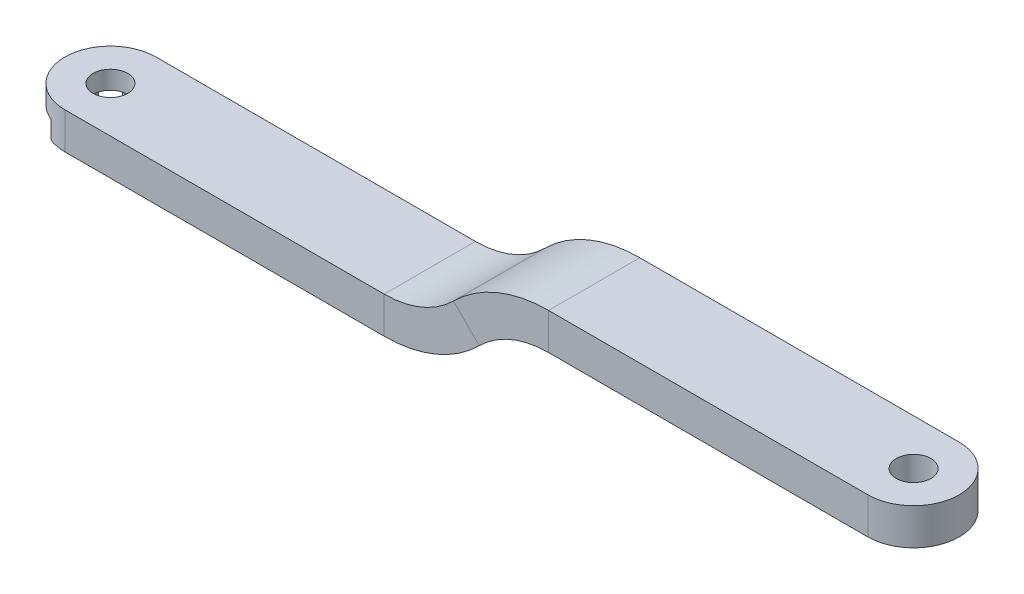
ISO-10303-21;
HEADER;
FILE_DESCRIPTION(('STEP AP214'),'2;1');
FILE_NAME('part.step','',(''),(''),'','','');
FILE_SCHEMA(('AUTOMOTIVE_DESIGN { 1 0 10303 214 1 1 1 1 }'));
ENDSEC;
DATA;
#1=APPLICATION_CONTEXT('core data for automotive mechanical design processes');
#2=APPLICATION_PROTOCOL_DEFINITION('international standard','automotive_design',2000,#1);
#3=PRODUCT_CONTEXT('',#1,'mechanical');
#4=PRODUCT('Part','Part','',(#3));
#5=PRODUCT_RELATED_PRODUCT_CATEGORY('part','',(#4));
#6=PRODUCT_DEFINITION_FORMATION('','',#4);
#7=PRODUCT_DEFINITION_CONTEXT('part definition',#1,'design');
#8=PRODUCT_DEFINITION('design','',#6,#7);
#9=PRODUCT_DEFINITION_SHAPE('','',#8);
#10=(LENGTH_UNIT() NAMED_UNIT(*) SI_UNIT(.MILLI.,.METRE.));
#11=(NAMED_UNIT(*) PLANE_ANGLE_UNIT() SI_UNIT($,.RADIAN.));
#12=(NAMED_UNIT(*) SI_UNIT($,.STERADIAN.) SOLID_ANGLE_UNIT());
#13=UNCERTAINTY_MEASURE_WITH_UNIT(LENGTH_MEASURE(1.E-05),#10,'distance_accuracy_value','');
#14=(GEOMETRIC_REPRESENTATION_CONTEXT(3) GLOBAL_UNCERTAINTY_ASSIGNED_CONTEXT((#13)) GLOBAL_UNIT_ASSIGNED_CONTEXT((#10,
#11,#12)) REPRESENTATION_CONTEXT('',''));
#15=CARTESIAN_POINT('',(0.,0.,0.));
#16=DIRECTION('',(0.,0.,1.));
#17=DIRECTION('',(1.,0.,0.));
#18=AXIS2_PLACEMENT_3D('',#15,#16,#17);
#19=CARTESIAN_POINT('',(0.,-2.53999999999999,6.35));
#20=DIRECTION('',(0.,-1.,0.));
#21=DIRECTION('',(0.,0.,-1.));
#22=AXIS2_PLACEMENT_3D('',#19,#20,#21);
#23=PLANE('',#22);
#24=DIRECTION('',(-0.923879532511286,0.,-0.382683432365092));
#25=VECTOR('',#24,1.);
#26=CARTESIAN_POINT('',(3.5340151849056,-2.53999999999999,-1.1664191018488));
#27=LINE('',#26,#25);
#28=CARTESIAN_POINT('',(3.5340151849056,-2.53999999999999,-1.16641910184879));
#29=VERTEX_POINT('',#28);
#30=CARTESIAN_POINT('',(0.483364968553333,-2.53999999999999,-2.43003979551833));
#31=VERTEX_POINT('',#30);
#32=EDGE_CURVE('E312',#29,#31,#27,.T.);
#33=ORIENTED_EDGE('',*,*,#32,.F.);
#34=CARTESIAN_POINT('',(6.35,-2.53999999999999,0.));
#35=DIRECTION('',(0.,-1.,0.));
#36=DIRECTION('',(0.,0.,-1.));
#37=AXIS2_PLACEMENT_3D('',#34,#35,#36);
#38=CIRCLE('',#37,3.048);
#39=CARTESIAN_POINT('',(3.5340151849056,-2.53999999999999,1.1664191018488));
#40=VERTEX_POINT('',#39);
#41=EDGE_CURVE('E309',#40,#29,#38,.T.);
#42=ORIENTED_EDGE('',*,*,#41,.F.);
#43=DIRECTION('',(0.923879532511287,0.,-0.38268343236509));
#44=VECTOR('',#43,1.);
#45=CARTESIAN_POINT('',(3.5340151849056,-2.53999999999999,1.1664191018488));
#46=LINE('',#45,#44);
#47=CARTESIAN_POINT('',(0.483364968553331,-2.53999999999999,2.43003979551832));
#48=VERTEX_POINT('',#47);
#49=EDGE_CURVE('E306',#48,#40,#46,.T.);
#50=ORIENTED_EDGE('',*,*,#49,.F.);
#51=CARTESIAN_POINT('',(6.35,-2.53999999999999,0.));
#52=DIRECTION('',(0.,-1.,0.));
#53=DIRECTION('',(0.,0.,-1.));
#54=AXIS2_PLACEMENT_3D('',#51,#52,#53);
#55=CIRCLE('',#54,6.35);
#56=EDGE_CURVE('E458',#48,#31,#55,.T.);
#57=ORIENTED_EDGE('',*,*,#56,.T.);
#58=EDGE_LOOP('',(#33,#42,#50,#57));
#59=FACE_BOUND('',#58,.T.);
#60=ADVANCED_FACE('F53',(#59),#23,.T.);
#61=CARTESIAN_POINT('',(6.35,-2.53999999999999,0.));
#62=DIRECTION('',(0.,1.,0.));
#63=DIRECTION('',(0.,0.,1.));
#64=AXIS2_PLACEMENT_3D('',#61,#62,#63);
#65=CYLINDRICAL_SURFACE('',#64,2.413);
#66=CARTESIAN_POINT('',(6.35,2.53999999999999,0.));
#67=DIRECTION('',(0.,1.,0.));
#68=DIRECTION('',(0.,0.,1.));
#69=AXIS2_PLACEMENT_3D('',#66,#67,#68);
#70=CIRCLE('',#69,2.413);
#71=CARTESIAN_POINT('',(6.35,2.53999999999999,2.413));
#72=VERTEX_POINT('',#71);
#73=EDGE_CURVE('E360',#72,#72,#70,.T.);
#74=ORIENTED_EDGE('',*,*,#73,.T.);
#75=EDGE_LOOP('',(#74));
#76=FACE_BOUND('',#75,.T.);
#77=CARTESIAN_POINT('',(6.35,0.,0.));
#78=DIRECTION('',(0.,-1.,0.));
#79=DIRECTION('',(0.,0.,1.));
#80=AXIS2_PLACEMENT_3D('',#77,#78,#79);
#81=CIRCLE('',#80,2.413);
#82=CARTESIAN_POINT('',(6.35,0.,2.413));
#83=VERTEX_POINT('',#82);
#84=EDGE_CURVE('E253',#83,#83,#81,.T.);
#85=ORIENTED_EDGE('',*,*,#84,.T.);
#86=EDGE_LOOP('',(#85));
#87=FACE_BOUND('',#86,.T.);
#88=ADVANCED_FACE('F579',(#76,#87),#65,.F.);
#89=CARTESIAN_POINT('',(118.118034430391,6.93225000588271,0.));
#90=DIRECTION('',(0.,-1.,0.));
#91=DIRECTION('',(0.,0.,-1.));
#92=AXIS2_PLACEMENT_3D('',#89,#90,#91);
#93=CYLINDRICAL_SURFACE('',#92,6.35);
#94=DIRECTION('',(0.,1.,0.));
#95=VECTOR('',#94,1.);
#96=CARTESIAN_POINT('',(118.118034430391,6.93225000588271,6.35));
#97=LINE('',#96,#95);
#98=CARTESIAN_POINT('',(118.118034430391,6.93225000588271,6.35));
#99=VERTEX_POINT('',#98);
#100=CARTESIAN_POINT('',(118.118034430391,12.0122500058827,6.35));
#101=VERTEX_POINT('',#100);
#102=EDGE_CURVE('E457',#99,#101,#97,.T.);
#103=ORIENTED_EDGE('',*,*,#102,.F.);
#104=CARTESIAN_POINT('',(118.118034430391,6.93225000588271,0.));
#105=DIRECTION('',(0.,-1.,0.));
#106=DIRECTION('',(1.,0.,0.));
#107=AXIS2_PLACEMENT_3D('',#104,#105,#106);
#108=CIRCLE('',#107,6.35);
#109=CARTESIAN_POINT('',(118.118034430391,6.93225000588271,-6.35));
#110=VERTEX_POINT('',#109);
#111=EDGE_CURVE('E62',#110,#99,#108,.T.);
#112=ORIENTED_EDGE('',*,*,#111,.F.);
#113=DIRECTION('',(0.,1.,0.));
#114=VECTOR('',#113,1.);
#115=CARTESIAN_POINT('',(118.118034430391,6.93225000588271,-6.35));
#116=LINE('',#115,#114);
#117=CARTESIAN_POINT('',(118.118034430391,12.0122500058827,-6.35));
#118=VERTEX_POINT('',#117);
#119=EDGE_CURVE('E461',#118,#110,#116,.F.);
#120=ORIENTED_EDGE('',*,*,#119,.F.);
#121=CARTESIAN_POINT('',(118.118034430391,12.0122500058827,0.));
#122=DIRECTION('',(0.,1.,0.));
#123=DIRECTION('',(-1.,0.,0.));
#124=AXIS2_PLACEMENT_3D('',#121,#122,#123);
#125=CIRCLE('',#124,6.35);
#126=EDGE_CURVE('E13',#101,#118,#125,.T.);
#127=ORIENTED_EDGE('',*,*,#126,.F.);
#128=EDGE_LOOP('',(#103,#112,#120,#127));
#129=FACE_BOUND('',#128,.T.);
#130=ADVANCED_FACE('F56',(#129),#93,.T.);
#131=CARTESIAN_POINT('',(6.35,2.53999999999999,0.));
#132=DIRECTION('',(0.,-1.,0.));
#133=DIRECTION('',(0.,0.,-1.));
#134=AXIS2_PLACEMENT_3D('',#131,#132,#133);
#135=CYLINDRICAL_SURFACE('',#134,6.35);
#136=DIRECTION('',(0.,-1.,0.));
#137=VECTOR('',#136,1.);
#138=CARTESIAN_POINT('',(3.91996020448168,0.,-5.86663503144667));
#139=LINE('',#138,#137);
#140=CARTESIAN_POINT('',(3.91996020448168,0.,-5.86663503144667));
#141=VERTEX_POINT('',#140);
#142=CARTESIAN_POINT('',(3.91996020448168,-2.53999999999999,-5.86663503144667));
#143=VERTEX_POINT('',#142);
#144=EDGE_CURVE('E336',#141,#143,#139,.T.);
#145=ORIENTED_EDGE('',*,*,#144,.F.);
#146=CARTESIAN_POINT('',(6.35,0.,0.));
#147=DIRECTION('',(0.,-1.,0.));
#148=DIRECTION('',(0.,0.,-1.));
#149=AXIS2_PLACEMENT_3D('',#146,#147,#148);
#150=CIRCLE('',#149,6.35);
#151=CARTESIAN_POINT('',(0.483364968553335,0.,-2.43003979551833));
#152=VERTEX_POINT('',#151);
#153=EDGE_CURVE('E277',#152,#141,#150,.T.);
#154=ORIENTED_EDGE('',*,*,#153,.F.);
#155=DIRECTION('',(0.,-1.,0.));
#156=VECTOR('',#155,1.);
#157=CARTESIAN_POINT('',(0.483364968553335,0.,-2.43003979551833));
#158=LINE('',#157,#156);
#159=EDGE_CURVE('E338',#152,#31,#158,.T.);
#160=ORIENTED_EDGE('',*,*,#159,.T.);
#161=ORIENTED_EDGE('',*,*,#56,.F.);
#162=DIRECTION('',(0.,-1.,0.));
#163=VECTOR('',#162,1.);
#164=CARTESIAN_POINT('',(0.483364968553333,0.,2.43003979551832));
#165=LINE('',#164,#163);
#166=CARTESIAN_POINT('',(0.483364968553333,0.,2.43003979551832));
#167=VERTEX_POINT('',#166);
#168=EDGE_CURVE('E345',#167,#48,#165,.T.);
#169=ORIENTED_EDGE('',*,*,#168,.F.);
#170=CARTESIAN_POINT('',(6.35,0.,0.));
#171=DIRECTION('',(0.,-1.,0.));
#172=DIRECTION('',(0.,0.,-1.));
#173=AXIS2_PLACEMENT_3D('',#170,#171,#172);
#174=CIRCLE('',#173,6.35);
#175=CARTESIAN_POINT('',(3.91996020448168,0.,5.86663503144667));
#176=VERTEX_POINT('',#175);
#177=EDGE_CURVE('E265',#176,#167,#174,.T.);
#178=ORIENTED_EDGE('',*,*,#177,.F.);
#179=DIRECTION('',(0.,-1.,0.));
#180=VECTOR('',#179,1.);
#181=CARTESIAN_POINT('',(3.91996020448168,0.,5.86663503144667));
#182=LINE('',#181,#180);
#183=CARTESIAN_POINT('',(3.91996020448168,-2.53999999999999,5.86663503144667));
#184=VERTEX_POINT('',#183);
#185=EDGE_CURVE('E347',#176,#184,#182,.T.);
#186=ORIENTED_EDGE('',*,*,#185,.T.);
#187=CARTESIAN_POINT('',(6.35,-2.53999999999999,6.35));
#188=VERTEX_POINT('',#187);
#189=EDGE_CURVE('E454',#188,#184,#55,.T.);
#190=ORIENTED_EDGE('',*,*,#189,.F.);
#191=DIRECTION('',(0.,-1.,0.));
#192=VECTOR('',#191,1.);
#193=CARTESIAN_POINT('',(6.35,-2.53999999999999,6.35));
#194=LINE('',#193,#192);
#195=CARTESIAN_POINT('',(6.35,2.53999999999999,6.35));
#196=VERTEX_POINT('',#195);
#197=EDGE_CURVE('E437',#196,#188,#194,.T.);
#198=ORIENTED_EDGE('',*,*,#197,.F.);
#199=CARTESIAN_POINT('',(6.35,2.53999999999999,0.));
#200=DIRECTION('',(0.,1.,0.));
#201=DIRECTION('',(0.,0.,1.));
#202=AXIS2_PLACEMENT_3D('',#199,#200,#201);
#203=CIRCLE('',#202,6.35);
#204=CARTESIAN_POINT('',(6.35,2.53999999999999,-6.35));
#205=VERTEX_POINT('',#204);
#206=EDGE_CURVE('E451',#205,#196,#203,.T.);
#207=ORIENTED_EDGE('',*,*,#206,.F.);
#208=DIRECTION('',(0.,-1.,0.));
#209=VECTOR('',#208,1.);
#210=CARTESIAN_POINT('',(6.35,-2.53999999999999,-6.35));
#211=LINE('',#210,#209);
#212=CARTESIAN_POINT('',(6.35,-2.53999999999999,-6.35));
#213=VERTEX_POINT('',#212);
#214=EDGE_CURVE('E448',#213,#205,#211,.F.);
#215=ORIENTED_EDGE('',*,*,#214,.F.);
#216=EDGE_CURVE('E453',#143,#213,#55,.T.);
#217=ORIENTED_EDGE('',*,*,#216,.F.);
#218=EDGE_LOOP('',(#145,#154,#160,#161,#169,#178,#186,#190,#198,#207,#215,#217));
#219=FACE_BOUND('',#218,.T.);
#220=ADVANCED_FACE('F521',(#219),#135,.T.);
#221=CARTESIAN_POINT('',(0.,-2.53999999999999,-6.35));
#222=DIRECTION('',(0.,0.,-1.));
#223=DIRECTION('',(-1.,0.,0.));
#224=AXIS2_PLACEMENT_3D('',#221,#222,#223);
#225=PLANE('',#224);
#226=DIRECTION('',(1.,0.,0.));
#227=VECTOR('',#226,1.);
#228=CARTESIAN_POINT('',(0.,-2.53999999999999,-6.35));
#229=LINE('',#228,#227);
#230=CARTESIAN_POINT('',(50.8,-2.53999999999999,-6.35));
#231=VERTEX_POINT('',#230);
#232=EDGE_CURVE('E363',#213,#231,#229,.T.);
#233=ORIENTED_EDGE('',*,*,#232,.F.);
#234=ORIENTED_EDGE('',*,*,#214,.T.);
#235=DIRECTION('',(1.,0.,0.));
#236=VECTOR('',#235,1.);
#237=CARTESIAN_POINT('',(0.,2.53999999999999,-6.35));
#238=LINE('',#237,#236);
#239=CARTESIAN_POINT('',(50.8,2.53999999999999,-6.35));
#240=VERTEX_POINT('',#239);
#241=EDGE_CURVE('E367',#205,#240,#238,.T.);
#242=ORIENTED_EDGE('',*,*,#241,.T.);
#243=DIRECTION('',(0.,1.,0.));
#244=VECTOR('',#243,1.);
#245=CARTESIAN_POINT('',(50.8,-2.53999999999999,-6.35));
#246=LINE('',#245,#244);
#247=EDGE_CURVE('E364',#231,#240,#246,.T.);
#248=ORIENTED_EDGE('',*,*,#247,.F.);
#249=EDGE_LOOP('',(#233,#234,#242,#248));
#250=FACE_BOUND('',#249,.T.);
#251=ADVANCED_FACE('F499',(#250),#225,.T.);
#252=CARTESIAN_POINT('',(0.,2.53999999999999,6.35));
#253=DIRECTION('',(0.,1.,0.));
#254=DIRECTION('',(0.,0.,1.));
#255=AXIS2_PLACEMENT_3D('',#252,#253,#254);
#256=PLANE('',#255);
#257=ORIENTED_EDGE('',*,*,#73,.F.);
#258=EDGE_LOOP('',(#257));
#259=FACE_BOUND('',#258,.T.);
#260=ORIENTED_EDGE('',*,*,#241,.F.);
#261=ORIENTED_EDGE('',*,*,#206,.T.);
#262=DIRECTION('',(1.,0.,0.));
#263=VECTOR('',#262,1.);
#264=CARTESIAN_POINT('',(0.,2.53999999999999,6.35));
#265=LINE('',#264,#263);
#266=CARTESIAN_POINT('',(50.8,2.53999999999999,6.35));
#267=VERTEX_POINT('',#266);
#268=EDGE_CURVE('E403',#196,#267,#265,.T.);
#269=ORIENTED_EDGE('',*,*,#268,.T.);
#270=DIRECTION('',(0.,0.,1.));
#271=VECTOR('',#270,1.);
#272=CARTESIAN_POINT('',(50.8,2.53999999999999,6.35));
#273=LINE('',#272,#271);
#274=EDGE_CURVE('E369',#240,#267,#273,.T.);
#275=ORIENTED_EDGE('',*,*,#274,.F.);
#276=EDGE_LOOP('',(#260,#261,#269,#275));
#277=FACE_BOUND('',#276,.T.);
#278=ADVANCED_FACE('F506',(#259,#277),#256,.T.);
#279=CARTESIAN_POINT('',(0.,-2.53999999999999,6.35));
#280=DIRECTION('',(0.,0.,1.));
#281=DIRECTION('',(1.,0.,0.));
#282=AXIS2_PLACEMENT_3D('',#279,#280,#281);
#283=PLANE('',#282);
#284=ORIENTED_EDGE('',*,*,#268,.F.);
#285=ORIENTED_EDGE('',*,*,#197,.T.);
#286=DIRECTION('',(1.,0.,0.));
#287=VECTOR('',#286,1.);
#288=CARTESIAN_POINT('',(0.,-2.53999999999999,6.35));
#289=LINE('',#288,#287);
#290=CARTESIAN_POINT('',(50.8,-2.53999999999999,6.35));
#291=VERTEX_POINT('',#290);
#292=EDGE_CURVE('E423',#188,#291,#289,.T.);
#293=ORIENTED_EDGE('',*,*,#292,.T.);
#294=DIRECTION('',(0.,-1.,0.));
#295=VECTOR('',#294,1.);
#296=CARTESIAN_POINT('',(50.8,-2.53999999999999,6.35));
#297=LINE('',#296,#295);
#298=EDGE_CURVE('E405',#267,#291,#297,.T.);
#299=ORIENTED_EDGE('',*,*,#298,.F.);
#300=EDGE_LOOP('',(#284,#285,#293,#299));
#301=FACE_BOUND('',#300,.T.);
#302=ADVANCED_FACE('F514',(#301),#283,.T.);
#303=DIRECTION('',(0.38268343236509,0.,0.923879532511287));
#304=VECTOR('',#303,1.);
#305=CARTESIAN_POINT('',(5.18358089815121,-2.53999999999999,-2.8159848150944));
#306=LINE('',#305,#304);
#307=CARTESIAN_POINT('',(5.18358089815121,-2.53999999999999,-2.8159848150944));
#308=VERTEX_POINT('',#307);
#309=EDGE_CURVE('E314',#143,#308,#306,.T.);
#310=ORIENTED_EDGE('',*,*,#309,.F.);
#311=ORIENTED_EDGE('',*,*,#216,.T.);
#312=ORIENTED_EDGE('',*,*,#232,.T.);
#313=DIRECTION('',(0.,0.,-1.));
#314=VECTOR('',#313,1.);
#315=CARTESIAN_POINT('',(50.8,-2.53999999999999,6.35));
#316=LINE('',#315,#314);
#317=EDGE_CURVE('E381',#291,#231,#316,.T.);
#318=ORIENTED_EDGE('',*,*,#317,.F.);
#319=ORIENTED_EDGE('',*,*,#292,.F.);
#320=ORIENTED_EDGE('',*,*,#189,.T.);
#321=DIRECTION('',(-0.382683432365092,0.,0.923879532511286));
#322=VECTOR('',#321,1.);
#323=CARTESIAN_POINT('',(5.18358089815121,-2.53999999999999,2.8159848150944));
#324=LINE('',#323,#322);
#325=CARTESIAN_POINT('',(5.18358089815121,-2.53999999999999,2.8159848150944));
#326=VERTEX_POINT('',#325);
#327=EDGE_CURVE('E304',#326,#184,#324,.T.);
#328=ORIENTED_EDGE('',*,*,#327,.F.);
#329=CARTESIAN_POINT('',(6.35,-2.53999999999999,0.));
#330=DIRECTION('',(0.,-1.,0.));
#331=DIRECTION('',(0.,0.,-1.));
#332=AXIS2_PLACEMENT_3D('',#329,#330,#331);
#333=CIRCLE('',#332,3.048);
#334=CARTESIAN_POINT('',(7.5164191018488,-2.53999999999999,2.8159848150944));
#335=VERTEX_POINT('',#334);
#336=EDGE_CURVE('E301',#335,#326,#333,.T.);
#337=ORIENTED_EDGE('',*,*,#336,.F.);
#338=DIRECTION('',(-0.38268343236509,0.,-0.923879532511287));
#339=VECTOR('',#338,1.);
#340=CARTESIAN_POINT('',(7.5164191018488,-2.53999999999999,2.8159848150944));
#341=LINE('',#340,#339);
#342=CARTESIAN_POINT('',(8.78003979551832,-2.53999999999999,5.86663503144667));
#343=VERTEX_POINT('',#342);
#344=EDGE_CURVE('E298',#343,#335,#341,.T.);
#345=ORIENTED_EDGE('',*,*,#344,.F.);
#346=CARTESIAN_POINT('',(6.35,-2.53999999999999,0.));
#347=DIRECTION('',(0.,-1.,0.));
#348=DIRECTION('',(0.,0.,-1.));
#349=AXIS2_PLACEMENT_3D('',#346,#347,#348);
#350=CIRCLE('',#349,6.35);
#351=CARTESIAN_POINT('',(12.2166350314467,-2.53999999999999,2.43003979551833));
#352=VERTEX_POINT('',#351);
#353=EDGE_CURVE('E295',#352,#343,#350,.T.);
#354=ORIENTED_EDGE('',*,*,#353,.F.);
#355=DIRECTION('',(0.923879532511286,0.,0.382683432365092));
#356=VECTOR('',#355,1.);
#357=CARTESIAN_POINT('',(9.1659848150944,-2.53999999999999,1.1664191018488));
#358=LINE('',#357,#356);
#359=CARTESIAN_POINT('',(9.1659848150944,-2.53999999999999,1.1664191018488));
#360=VERTEX_POINT('',#359);
#361=EDGE_CURVE('E293',#360,#352,#358,.T.);
#362=ORIENTED_EDGE('',*,*,#361,.F.);
#363=CARTESIAN_POINT('',(6.35,-2.53999999999999,0.));
#364=DIRECTION('',(0.,-1.,0.));
#365=DIRECTION('',(0.,0.,-1.));
#366=AXIS2_PLACEMENT_3D('',#363,#364,#365);
#367=CIRCLE('',#366,3.048);
#368=CARTESIAN_POINT('',(9.1659848150944,-2.53999999999999,-1.16641910184879));
#369=VERTEX_POINT('',#368);
#370=EDGE_CURVE('E69',#369,#360,#367,.T.);
#371=ORIENTED_EDGE('',*,*,#370,.F.);
#372=DIRECTION('',(-0.923879532511287,0.,0.38268343236509));
#373=VECTOR('',#372,1.);
#374=CARTESIAN_POINT('',(9.1659848150944,-2.53999999999999,-1.16641910184879));
#375=LINE('',#374,#373);
#376=CARTESIAN_POINT('',(12.2166350314467,-2.53999999999999,-2.43003979551832));
#377=VERTEX_POINT('',#376);
#378=EDGE_CURVE('E247',#377,#369,#375,.T.);
#379=ORIENTED_EDGE('',*,*,#378,.F.);
#380=CARTESIAN_POINT('',(6.35,-2.53999999999999,0.));
#381=DIRECTION('',(0.,-1.,0.));
#382=DIRECTION('',(0.,0.,-1.));
#383=AXIS2_PLACEMENT_3D('',#380,#381,#382);
#384=CIRCLE('',#383,6.35);
#385=CARTESIAN_POINT('',(8.78003979551834,-2.53999999999999,-5.86663503144667));
#386=VERTEX_POINT('',#385);
#387=EDGE_CURVE('E250',#386,#377,#384,.T.);
#388=ORIENTED_EDGE('',*,*,#387,.F.);
#389=DIRECTION('',(0.382683432365092,0.,-0.923879532511286));
#390=VECTOR('',#389,1.);
#391=CARTESIAN_POINT('',(7.5164191018488,-2.53999999999999,-2.8159848150944));
#392=LINE('',#391,#390);
#393=CARTESIAN_POINT('',(7.5164191018488,-2.53999999999999,-2.8159848150944));
#394=VERTEX_POINT('',#393);
#395=EDGE_CURVE('E320',#394,#386,#392,.T.);
#396=ORIENTED_EDGE('',*,*,#395,.F.);
#397=CARTESIAN_POINT('',(6.35,-2.53999999999999,0.));
#398=DIRECTION('',(0.,-1.,0.));
#399=DIRECTION('',(0.,0.,-1.));
#400=AXIS2_PLACEMENT_3D('',#397,#398,#399);
#401=CIRCLE('',#400,3.048);
#402=EDGE_CURVE('E317',#308,#394,#401,.T.);
#403=ORIENTED_EDGE('',*,*,#402,.F.);
#404=EDGE_LOOP('',(#310,#311,#312,#318,#319,#320,#328,#337,#345,#354,#362,#371,#379,#388,#396,#403));
#405=FACE_BOUND('',#404,.T.);
#406=ADVANCED_FACE('F516',(#405),#23,.T.);
#407=CARTESIAN_POINT('',(50.8,-2.53999999999999,-6.35));
#408=DIRECTION('',(0.,0.,-1.));
#409=DIRECTION('',(-1.,0.,0.));
#410=AXIS2_PLACEMENT_3D('',#407,#408,#409);
#411=PLANE('',#410);
#412=CARTESIAN_POINT('',(50.8,16.1701422181366,-6.35));
#413=DIRECTION('',(0.,0.,1.));
#414=DIRECTION('',(0.,-1.,0.));
#415=AXIS2_PLACEMENT_3D('',#412,#413,#414);
#416=CIRCLE('',#415,13.6301422181365);
#417=CARTESIAN_POINT('',(60.4379659909814,6.53217622715518,-6.35));
#418=VERTEX_POINT('',#417);
#419=EDGE_CURVE('E374',#240,#418,#416,.T.);
#420=ORIENTED_EDGE('',*,*,#419,.T.);
#421=DIRECTION('',(-0.707106781186549,0.707106781186546,0.));
#422=VECTOR('',#421,1.);
#423=CARTESIAN_POINT('',(64.0300684394091,2.94007377872751,-6.35));
#424=LINE('',#423,#422);
#425=CARTESIAN_POINT('',(64.0300684394091,2.94007377872751,-6.35));
#426=VERTEX_POINT('',#425);
#427=EDGE_CURVE('E371',#426,#418,#424,.T.);
#428=ORIENTED_EDGE('',*,*,#427,.F.);
#429=CARTESIAN_POINT('',(50.8,16.1701422181366,-6.35));
#430=DIRECTION('',(0.,0.,1.));
#431=DIRECTION('',(0.,-1.,0.));
#432=AXIS2_PLACEMENT_3D('',#429,#430,#431);
#433=CIRCLE('',#432,18.7101422181365);
#434=EDGE_CURVE('E375',#231,#426,#433,.T.);
#435=ORIENTED_EDGE('',*,*,#434,.F.);
#436=ORIENTED_EDGE('',*,*,#247,.T.);
#437=EDGE_LOOP('',(#420,#428,#435,#436));
#438=FACE_BOUND('',#437,.T.);
#439=ADVANCED_FACE('F490',(#438),#411,.T.);
#440=CARTESIAN_POINT('',(50.8,16.1701422181366,0.));
#441=DIRECTION('',(0.,0.,1.));
#442=DIRECTION('',(1.,0.,0.));
#443=AXIS2_PLACEMENT_3D('',#440,#441,#442);
#444=CYLINDRICAL_SURFACE('',#443,13.6301422181365);
#445=CARTESIAN_POINT('',(50.8,16.1701422181366,6.35));
#446=DIRECTION('',(0.,0.,1.));
#447=DIRECTION('',(0.,-1.,0.));
#448=AXIS2_PLACEMENT_3D('',#445,#446,#447);
#449=CIRCLE('',#448,13.6301422181365);
#450=CARTESIAN_POINT('',(60.4379659909814,6.53217622715518,6.35));
#451=VERTEX_POINT('',#450);
#452=EDGE_CURVE('E408',#267,#451,#449,.T.);
#453=ORIENTED_EDGE('',*,*,#452,.T.);
#454=DIRECTION('',(0.,0.,1.));
#455=VECTOR('',#454,1.);
#456=CARTESIAN_POINT('',(60.4379659909814,6.53217622715518,6.35));
#457=LINE('',#456,#455);
#458=EDGE_CURVE('E378',#418,#451,#457,.T.);
#459=ORIENTED_EDGE('',*,*,#458,.F.);
#460=ORIENTED_EDGE('',*,*,#419,.F.);
#461=ORIENTED_EDGE('',*,*,#274,.T.);
#462=EDGE_LOOP('',(#453,#459,#460,#461));
#463=FACE_BOUND('',#462,.T.);
#464=ADVANCED_FACE('F505',(#463),#444,.F.);
#465=CARTESIAN_POINT('',(50.8,-2.53999999999999,6.35));
#466=DIRECTION('',(0.,0.,1.));
#467=DIRECTION('',(1.,0.,0.));
#468=AXIS2_PLACEMENT_3D('',#465,#466,#467);
#469=PLANE('',#468);
#470=CARTESIAN_POINT('',(50.8,16.1701422181366,6.35));
#471=DIRECTION('',(0.,0.,1.));
#472=DIRECTION('',(0.,-1.,0.));
#473=AXIS2_PLACEMENT_3D('',#470,#471,#472);
#474=CIRCLE('',#473,18.7101422181365);
#475=CARTESIAN_POINT('',(64.0300684394091,2.94007377872751,6.35));
#476=VERTEX_POINT('',#475);
#477=EDGE_CURVE('E427',#291,#476,#474,.T.);
#478=ORIENTED_EDGE('',*,*,#477,.T.);
#479=DIRECTION('',(0.707106781186549,-0.707106781186546,0.));
#480=VECTOR('',#479,1.);
#481=CARTESIAN_POINT('',(64.0300684394091,2.94007377872751,6.35));
#482=LINE('',#481,#480);
#483=EDGE_CURVE('E411',#451,#476,#482,.T.);
#484=ORIENTED_EDGE('',*,*,#483,.F.);
#485=ORIENTED_EDGE('',*,*,#452,.F.);
#486=ORIENTED_EDGE('',*,*,#298,.T.);
#487=EDGE_LOOP('',(#478,#484,#485,#486));
#488=FACE_BOUND('',#487,.T.);
#489=ADVANCED_FACE('F513',(#488),#469,.T.);
#490=CARTESIAN_POINT('',(50.8,16.1701422181366,0.));
#491=DIRECTION('',(0.,0.,1.));
#492=DIRECTION('',(1.,0.,0.));
#493=AXIS2_PLACEMENT_3D('',#490,#491,#492);
#494=CYLINDRICAL_SURFACE('',#493,18.7101422181365);
#495=DIRECTION('',(0.,0.,-1.));
#496=VECTOR('',#495,1.);
#497=CARTESIAN_POINT('',(64.0300684394091,2.94007377872751,6.35));
#498=LINE('',#497,#496);
#499=EDGE_CURVE('E392',#476,#426,#498,.T.);
#500=ORIENTED_EDGE('',*,*,#499,.F.);
#501=ORIENTED_EDGE('',*,*,#477,.F.);
#502=ORIENTED_EDGE('',*,*,#317,.T.);
#503=ORIENTED_EDGE('',*,*,#434,.T.);
#504=EDGE_LOOP('',(#500,#501,#502,#503));
#505=FACE_BOUND('',#504,.T.);
#506=ADVANCED_FACE('F492',(#505),#494,.T.);
#507=CARTESIAN_POINT('',(64.0300684394091,2.94007377872751,-6.35));
#508=DIRECTION('',(0.,0.,-1.));
#509=DIRECTION('',(-1.,0.,0.));
#510=AXIS2_PLACEMENT_3D('',#507,#508,#509);
#511=PLANE('',#510);
#512=CARTESIAN_POINT('',(73.6680344303906,-6.69789221225392,-6.35));
#513=DIRECTION('',(0.,0.,-1.));
#514=DIRECTION('',(-0.707106781186549,0.707106781186546,0.));
#515=AXIS2_PLACEMENT_3D('',#512,#513,#514);
#516=CIRCLE('',#515,18.7101422181366);
#517=CARTESIAN_POINT('',(73.6680344303906,12.0122500058827,-6.35));
#518=VERTEX_POINT('',#517);
#519=EDGE_CURVE('E385',#418,#518,#516,.T.);
#520=ORIENTED_EDGE('',*,*,#519,.T.);
#521=DIRECTION('',(0.,1.,0.));
#522=VECTOR('',#521,1.);
#523=CARTESIAN_POINT('',(73.6680344303906,6.93225000588266,-6.35));
#524=LINE('',#523,#522);
#525=CARTESIAN_POINT('',(73.6680344303906,6.93225000588266,-6.35));
#526=VERTEX_POINT('',#525);
#527=EDGE_CURVE('E382',#526,#518,#524,.T.);
#528=ORIENTED_EDGE('',*,*,#527,.F.);
#529=CARTESIAN_POINT('',(73.6680344303906,-6.69789221225392,-6.35));
#530=DIRECTION('',(0.,0.,-1.));
#531=DIRECTION('',(-0.707106781186549,0.707106781186546,0.));
#532=AXIS2_PLACEMENT_3D('',#529,#530,#531);
#533=CIRCLE('',#532,13.6301422181366);
#534=EDGE_CURVE('E386',#426,#526,#533,.T.);
#535=ORIENTED_EDGE('',*,*,#534,.F.);
#536=ORIENTED_EDGE('',*,*,#427,.T.);
#537=EDGE_LOOP('',(#520,#528,#535,#536));
#538=FACE_BOUND('',#537,.T.);
#539=ADVANCED_FACE('F481',(#538),#511,.T.);
#540=CARTESIAN_POINT('',(73.6680344303906,-6.69789221225392,0.));
#541=DIRECTION('',(0.,0.,-1.));
#542=DIRECTION('',(-1.,0.,0.));
#543=AXIS2_PLACEMENT_3D('',#540,#541,#542);
#544=CYLINDRICAL_SURFACE('',#543,18.7101422181366);
#545=CARTESIAN_POINT('',(73.6680344303906,-6.69789221225392,6.35));
#546=DIRECTION('',(0.,0.,-1.));
#547=DIRECTION('',(-0.707106781186549,0.707106781186546,0.));
#548=AXIS2_PLACEMENT_3D('',#545,#546,#547);
#549=CIRCLE('',#548,18.7101422181366);
#550=CARTESIAN_POINT('',(73.6680344303906,12.0122500058827,6.35));
#551=VERTEX_POINT('',#550);
#552=EDGE_CURVE('E414',#451,#551,#549,.T.);
#553=ORIENTED_EDGE('',*,*,#552,.T.);
#554=DIRECTION('',(0.,0.,1.));
#555=VECTOR('',#554,1.);
#556=CARTESIAN_POINT('',(73.6680344303906,12.0122500058827,6.35));
#557=LINE('',#556,#555);
#558=EDGE_CURVE('E389',#518,#551,#557,.T.);
#559=ORIENTED_EDGE('',*,*,#558,.F.);
#560=ORIENTED_EDGE('',*,*,#519,.F.);
#561=ORIENTED_EDGE('',*,*,#458,.T.);
#562=EDGE_LOOP('',(#553,#559,#560,#561));
#563=FACE_BOUND('',#562,.T.);
#564=ADVANCED_FACE('F473',(#563),#544,.T.);
#565=CARTESIAN_POINT('',(64.0300684394091,2.94007377872751,6.35));
#566=DIRECTION('',(0.,0.,1.));
#567=DIRECTION('',(1.,0.,0.));
#568=AXIS2_PLACEMENT_3D('',#565,#566,#567);
#569=PLANE('',#568);
#570=CARTESIAN_POINT('',(73.6680344303906,-6.69789221225392,6.35));
#571=DIRECTION('',(0.,0.,-1.));
#572=DIRECTION('',(-0.707106781186549,0.707106781186546,0.));
#573=AXIS2_PLACEMENT_3D('',#570,#571,#572);
#574=CIRCLE('',#573,13.6301422181366);
#575=CARTESIAN_POINT('',(73.6680344303906,6.93225000588266,6.35));
#576=VERTEX_POINT('',#575);
#577=EDGE_CURVE('E432',#476,#576,#574,.T.);
#578=ORIENTED_EDGE('',*,*,#577,.T.);
#579=DIRECTION('',(0.,-1.,0.));
#580=VECTOR('',#579,1.);
#581=CARTESIAN_POINT('',(73.6680344303906,6.93225000588266,6.35));
#582=LINE('',#581,#580);
#583=EDGE_CURVE('E417',#551,#576,#582,.T.);
#584=ORIENTED_EDGE('',*,*,#583,.F.);
#585=ORIENTED_EDGE('',*,*,#552,.F.);
#586=ORIENTED_EDGE('',*,*,#483,.T.);
#587=EDGE_LOOP('',(#578,#584,#585,#586));
#588=FACE_BOUND('',#587,.T.);
#589=ADVANCED_FACE('F469',(#588),#569,.T.);
#590=CARTESIAN_POINT('',(73.6680344303906,-6.69789221225392,0.));
#591=DIRECTION('',(0.,0.,-1.));
#592=DIRECTION('',(-1.,0.,0.));
#593=AXIS2_PLACEMENT_3D('',#590,#591,#592);
#594=CYLINDRICAL_SURFACE('',#593,13.6301422181366);
#595=DIRECTION('',(0.,0.,-1.));
#596=VECTOR('',#595,1.);
#597=CARTESIAN_POINT('',(73.6680344303906,6.93225000588266,6.35));
#598=LINE('',#597,#596);
#599=EDGE_CURVE('E400',#576,#526,#598,.T.);
#600=ORIENTED_EDGE('',*,*,#599,.F.);
#601=ORIENTED_EDGE('',*,*,#577,.F.);
#602=ORIENTED_EDGE('',*,*,#499,.T.);
#603=ORIENTED_EDGE('',*,*,#534,.T.);
#604=EDGE_LOOP('',(#600,#601,#602,#603));
#605=FACE_BOUND('',#604,.T.);
#606=ADVANCED_FACE('F483',(#605),#594,.F.);
#607=CARTESIAN_POINT('',(73.6680344303906,6.93225000588266,-6.35));
#608=DIRECTION('',(0.,0.,-1.));
#609=DIRECTION('',(-1.,0.,0.));
#610=AXIS2_PLACEMENT_3D('',#607,#608,#609);
#611=PLANE('',#610);
#612=DIRECTION('',(1.,0.,0.));
#613=VECTOR('',#612,1.);
#614=CARTESIAN_POINT('',(73.6680344303906,12.0122500058827,-6.35));
#615=LINE('',#614,#613);
#616=EDGE_CURVE('E393',#518,#118,#615,.T.);
#617=ORIENTED_EDGE('',*,*,#616,.T.);
#618=ORIENTED_EDGE('',*,*,#119,.T.);
#619=DIRECTION('',(1.,0.,0.));
#620=VECTOR('',#619,1.);
#621=CARTESIAN_POINT('',(73.6680344303906,6.93225000588266,-6.35));
#622=LINE('',#621,#620);
#623=EDGE_CURVE('E397',#526,#110,#622,.T.);
#624=ORIENTED_EDGE('',*,*,#623,.F.);
#625=ORIENTED_EDGE('',*,*,#527,.T.);
#626=EDGE_LOOP('',(#617,#618,#624,#625));
#627=FACE_BOUND('',#626,.T.);
#628=ADVANCED_FACE('F478',(#627),#611,.T.);
#629=CARTESIAN_POINT('',(73.6680344303906,12.0122500058827,6.35));
#630=DIRECTION('',(0.,1.,0.));
#631=DIRECTION('',(-1.,0.,0.));
#632=AXIS2_PLACEMENT_3D('',#629,#630,#631);
#633=PLANE('',#632);
#634=CARTESIAN_POINT('',(118.118034430391,12.0122500058827,0.));
#635=DIRECTION('',(0.,1.,0.));
#636=DIRECTION('',(0.,0.,1.));
#637=AXIS2_PLACEMENT_3D('',#634,#635,#636);
#638=CIRCLE('',#637,2.413);
#639=CARTESIAN_POINT('',(118.118034430391,12.0122500058827,2.413));
#640=VERTEX_POINT('',#639);
#641=EDGE_CURVE('E327',#640,#640,#638,.T.);
#642=ORIENTED_EDGE('',*,*,#641,.F.);
#643=EDGE_LOOP('',(#642));
#644=FACE_BOUND('',#643,.T.);
#645=DIRECTION('',(1.,0.,0.));
#646=VECTOR('',#645,1.);
#647=CARTESIAN_POINT('',(73.6680344303906,12.0122500058827,6.35));
#648=LINE('',#647,#646);
#649=EDGE_CURVE('E396',#551,#101,#648,.T.);
#650=ORIENTED_EDGE('',*,*,#649,.T.);
#651=ORIENTED_EDGE('',*,*,#126,.T.);
#652=ORIENTED_EDGE('',*,*,#616,.F.);
#653=ORIENTED_EDGE('',*,*,#558,.T.);
#654=EDGE_LOOP('',(#650,#651,#652,#653));
#655=FACE_BOUND('',#654,.T.);
#656=ADVANCED_FACE('F476',(#644,#655),#633,.T.);
#657=CARTESIAN_POINT('',(73.6680344303906,6.93225000588266,6.35));
#658=DIRECTION('',(0.,0.,1.));
#659=DIRECTION('',(1.,0.,0.));
#660=AXIS2_PLACEMENT_3D('',#657,#658,#659);
#661=PLANE('',#660);
#662=DIRECTION('',(1.,0.,0.));
#663=VECTOR('',#662,1.);
#664=CARTESIAN_POINT('',(73.6680344303906,6.93225000588266,6.35));
#665=LINE('',#664,#663);
#666=EDGE_CURVE('E420',#576,#99,#665,.T.);
#667=ORIENTED_EDGE('',*,*,#666,.T.);
#668=ORIENTED_EDGE('',*,*,#102,.T.);
#669=ORIENTED_EDGE('',*,*,#649,.F.);
#670=ORIENTED_EDGE('',*,*,#583,.T.);
#671=EDGE_LOOP('',(#667,#668,#669,#670));
#672=FACE_BOUND('',#671,.T.);
#673=ADVANCED_FACE('F466',(#672),#661,.T.);
#674=CARTESIAN_POINT('',(73.6680344303906,6.93225000588266,6.35));
#675=DIRECTION('',(0.,-1.,0.));
#676=DIRECTION('',(1.,0.,0.));
#677=AXIS2_PLACEMENT_3D('',#674,#675,#676);
#678=PLANE('',#677);
#679=CARTESIAN_POINT('',(118.118034430391,6.93225000588271,0.));
#680=DIRECTION('',(0.,-1.,0.));
#681=DIRECTION('',(1.,0.,0.));
#682=AXIS2_PLACEMENT_3D('',#679,#680,#681);
#683=CIRCLE('',#682,2.413);
#684=CARTESIAN_POINT('',(120.531034430391,6.93225000588271,0.));
#685=VERTEX_POINT('',#684);
#686=EDGE_CURVE('E359',#685,#685,#683,.T.);
#687=ORIENTED_EDGE('',*,*,#686,.F.);
#688=EDGE_LOOP('',(#687));
#689=FACE_BOUND('',#688,.T.);
#690=ORIENTED_EDGE('',*,*,#623,.T.);
#691=ORIENTED_EDGE('',*,*,#111,.T.);
#692=ORIENTED_EDGE('',*,*,#666,.F.);
#693=ORIENTED_EDGE('',*,*,#599,.T.);
#694=EDGE_LOOP('',(#690,#691,#692,#693));
#695=FACE_BOUND('',#694,.T.);
#696=ADVANCED_FACE('F463',(#689,#695),#678,.T.);
#697=CARTESIAN_POINT('',(118.118034430391,-2.53999999999999,0.));
#698=DIRECTION('',(0.,1.,0.));
#699=DIRECTION('',(0.,0.,1.));
#700=AXIS2_PLACEMENT_3D('',#697,#698,#699);
#701=CYLINDRICAL_SURFACE('',#700,2.413);
#702=ORIENTED_EDGE('',*,*,#686,.T.);
#703=EDGE_LOOP('',(#702));
#704=FACE_BOUND('',#703,.T.);
#705=ORIENTED_EDGE('',*,*,#641,.T.);
#706=EDGE_LOOP('',(#705));
#707=FACE_BOUND('',#706,.T.);
#708=ADVANCED_FACE('F611',(#704,#707),#701,.F.);
#709=CARTESIAN_POINT('',(6.35,0.,0.));
#710=DIRECTION('',(0.,-1.,0.));
#711=DIRECTION('',(0.,0.,-1.));
#712=AXIS2_PLACEMENT_3D('',#709,#710,#711);
#713=CYLINDRICAL_SURFACE('',#712,3.048);
#714=ORIENTED_EDGE('',*,*,#370,.T.);
#715=DIRECTION('',(0.,-1.,0.));
#716=VECTOR('',#715,1.);
#717=CARTESIAN_POINT('',(9.1659848150944,0.,1.1664191018488));
#718=LINE('',#717,#716);
#719=CARTESIAN_POINT('',(9.1659848150944,0.,1.1664191018488));
#720=VERTEX_POINT('',#719);
#721=EDGE_CURVE('E224',#720,#360,#718,.T.);
#722=ORIENTED_EDGE('',*,*,#721,.F.);
#723=CARTESIAN_POINT('',(6.35,0.,0.));
#724=DIRECTION('',(0.,-1.,0.));
#725=DIRECTION('',(0.,0.,-1.));
#726=AXIS2_PLACEMENT_3D('',#723,#724,#725);
#727=CIRCLE('',#726,3.048);
#728=CARTESIAN_POINT('',(9.1659848150944,0.,-1.16641910184879));
#729=VERTEX_POINT('',#728);
#730=EDGE_CURVE('E228',#729,#720,#727,.T.);
#731=ORIENTED_EDGE('',*,*,#730,.F.);
#732=DIRECTION('',(0.,-1.,0.));
#733=VECTOR('',#732,1.);
#734=CARTESIAN_POINT('',(9.1659848150944,0.,-1.16641910184879));
#735=LINE('',#734,#733);
#736=EDGE_CURVE('E325',#729,#369,#735,.T.);
#737=ORIENTED_EDGE('',*,*,#736,.T.);
#738=EDGE_LOOP('',(#714,#722,#731,#737));
#739=FACE_BOUND('',#738,.T.);
#740=ADVANCED_FACE('F226',(#739),#713,.F.);
#741=CARTESIAN_POINT('',(9.1659848150944,0.,-1.16641910184879));
#742=DIRECTION('',(0.38268343236509,0.,0.923879532511288));
#743=DIRECTION('',(0.923879532511287,0.,-0.382683432365089));
#744=AXIS2_PLACEMENT_3D('',#741,#742,#743);
#745=PLANE('',#744);
#746=ORIENTED_EDGE('',*,*,#378,.T.);
#747=ORIENTED_EDGE('',*,*,#736,.F.);
#748=DIRECTION('',(-0.923879532511287,0.,0.38268343236509));
#749=VECTOR('',#748,1.);
#750=CARTESIAN_POINT('',(9.1659848150944,0.,-1.16641910184879));
#751=LINE('',#750,#749);
#752=CARTESIAN_POINT('',(12.2166350314467,0.,-2.43003979551832));
#753=VERTEX_POINT('',#752);
#754=EDGE_CURVE('E234',#753,#729,#751,.T.);
#755=ORIENTED_EDGE('',*,*,#754,.F.);
#756=DIRECTION('',(0.,-1.,0.));
#757=VECTOR('',#756,1.);
#758=CARTESIAN_POINT('',(12.2166350314467,0.,-2.43003979551832));
#759=LINE('',#758,#757);
#760=EDGE_CURVE('E328',#753,#377,#759,.T.);
#761=ORIENTED_EDGE('',*,*,#760,.T.);
#762=EDGE_LOOP('',(#746,#747,#755,#761));
#763=FACE_BOUND('',#762,.T.);
#764=ADVANCED_FACE('F541',(#763),#745,.F.);
#765=CARTESIAN_POINT('',(6.35,0.,0.));
#766=DIRECTION('',(0.,-1.,0.));
#767=DIRECTION('',(0.,0.,-1.));
#768=AXIS2_PLACEMENT_3D('',#765,#766,#767);
#769=CYLINDRICAL_SURFACE('',#768,6.35);
#770=ORIENTED_EDGE('',*,*,#387,.T.);
#771=ORIENTED_EDGE('',*,*,#760,.F.);
#772=CARTESIAN_POINT('',(6.35,0.,0.));
#773=DIRECTION('',(0.,-1.,0.));
#774=DIRECTION('',(0.,0.,-1.));
#775=AXIS2_PLACEMENT_3D('',#772,#773,#774);
#776=CIRCLE('',#775,6.35);
#777=CARTESIAN_POINT('',(8.78003979551834,0.,-5.86663503144667));
#778=VERTEX_POINT('',#777);
#779=EDGE_CURVE('E289',#778,#753,#776,.T.);
#780=ORIENTED_EDGE('',*,*,#779,.F.);
#781=DIRECTION('',(0.,-1.,0.));
#782=VECTOR('',#781,1.);
#783=CARTESIAN_POINT('',(8.78003979551834,0.,-5.86663503144667));
#784=LINE('',#783,#782);
#785=EDGE_CURVE('E330',#778,#386,#784,.T.);
#786=ORIENTED_EDGE('',*,*,#785,.T.);
#787=EDGE_LOOP('',(#770,#771,#780,#786));
#788=FACE_BOUND('',#787,.T.);
#789=ADVANCED_FACE('F544',(#788),#769,.F.);
#790=CARTESIAN_POINT('',(7.5164191018488,0.,-2.8159848150944));
#791=DIRECTION('',(-0.923879532511286,0.,-0.382683432365092));
#792=DIRECTION('',(-0.382683432365092,0.,0.923879532511286));
#793=AXIS2_PLACEMENT_3D('',#790,#791,#792);
#794=PLANE('',#793);
#795=ORIENTED_EDGE('',*,*,#395,.T.);
#796=ORIENTED_EDGE('',*,*,#785,.F.);
#797=DIRECTION('',(0.382683432365092,0.,-0.923879532511286));
#798=VECTOR('',#797,1.);
#799=CARTESIAN_POINT('',(7.5164191018488,0.,-2.8159848150944));
#800=LINE('',#799,#798);
#801=CARTESIAN_POINT('',(7.5164191018488,0.,-2.8159848150944));
#802=VERTEX_POINT('',#801);
#803=EDGE_CURVE('E286',#802,#778,#800,.T.);
#804=ORIENTED_EDGE('',*,*,#803,.F.);
#805=DIRECTION('',(0.,-1.,0.));
#806=VECTOR('',#805,1.);
#807=CARTESIAN_POINT('',(7.5164191018488,0.,-2.8159848150944));
#808=LINE('',#807,#806);
#809=EDGE_CURVE('E332',#802,#394,#808,.T.);
#810=ORIENTED_EDGE('',*,*,#809,.T.);
#811=EDGE_LOOP('',(#795,#796,#804,#810));
#812=FACE_BOUND('',#811,.T.);
#813=ADVANCED_FACE('F547',(#812),#794,.F.);
#814=CARTESIAN_POINT('',(6.35,0.,0.));
#815=DIRECTION('',(0.,-1.,0.));
#816=DIRECTION('',(0.,0.,-1.));
#817=AXIS2_PLACEMENT_3D('',#814,#815,#816);
#818=CYLINDRICAL_SURFACE('',#817,3.048);
#819=ORIENTED_EDGE('',*,*,#402,.T.);
#820=ORIENTED_EDGE('',*,*,#809,.F.);
#821=CARTESIAN_POINT('',(6.35,0.,0.));
#822=DIRECTION('',(0.,-1.,0.));
#823=DIRECTION('',(0.,0.,-1.));
#824=AXIS2_PLACEMENT_3D('',#821,#822,#823);
#825=CIRCLE('',#824,3.048);
#826=CARTESIAN_POINT('',(5.18358089815121,0.,-2.8159848150944));
#827=VERTEX_POINT('',#826);
#828=EDGE_CURVE('E283',#827,#802,#825,.T.);
#829=ORIENTED_EDGE('',*,*,#828,.F.);
#830=DIRECTION('',(0.,-1.,0.));
#831=VECTOR('',#830,1.);
#832=CARTESIAN_POINT('',(5.18358089815121,0.,-2.8159848150944));
#833=LINE('',#832,#831);
#834=EDGE_CURVE('E334',#827,#308,#833,.T.);
#835=ORIENTED_EDGE('',*,*,#834,.T.);
#836=EDGE_LOOP('',(#819,#820,#829,#835));
#837=FACE_BOUND('',#836,.T.);
#838=ADVANCED_FACE('F551',(#837),#818,.F.);
#839=CARTESIAN_POINT('',(5.18358089815121,0.,-2.8159848150944));
#840=DIRECTION('',(0.923879532511287,0.,-0.38268343236509));
#841=DIRECTION('',(-0.38268343236509,0.,-0.923879532511287));
#842=AXIS2_PLACEMENT_3D('',#839,#840,#841);
#843=PLANE('',#842);
#844=ORIENTED_EDGE('',*,*,#309,.T.);
#845=ORIENTED_EDGE('',*,*,#834,.F.);
#846=DIRECTION('',(0.38268343236509,0.,0.923879532511287));
#847=VECTOR('',#846,1.);
#848=CARTESIAN_POINT('',(5.18358089815121,0.,-2.8159848150944));
#849=LINE('',#848,#847);
#850=EDGE_CURVE('E280',#141,#827,#849,.T.);
#851=ORIENTED_EDGE('',*,*,#850,.F.);
#852=ORIENTED_EDGE('',*,*,#144,.T.);
#853=EDGE_LOOP('',(#844,#845,#851,#852));
#854=FACE_BOUND('',#853,.T.);
#855=ADVANCED_FACE('F554',(#854),#843,.F.);
#856=CARTESIAN_POINT('',(3.5340151849056,0.,-1.1664191018488));
#857=DIRECTION('',(-0.382683432365092,0.,0.923879532511286));
#858=DIRECTION('',(0.923879532511286,0.,0.382683432365092));
#859=AXIS2_PLACEMENT_3D('',#856,#857,#858);
#860=PLANE('',#859);
#861=ORIENTED_EDGE('',*,*,#32,.T.);
#862=ORIENTED_EDGE('',*,*,#159,.F.);
#863=DIRECTION('',(-0.923879532511286,0.,-0.382683432365092));
#864=VECTOR('',#863,1.);
#865=CARTESIAN_POINT('',(3.5340151849056,0.,-1.1664191018488));
#866=LINE('',#865,#864);
#867=CARTESIAN_POINT('',(3.5340151849056,0.,-1.16641910184879));
#868=VERTEX_POINT('',#867);
#869=EDGE_CURVE('E274',#868,#152,#866,.T.);
#870=ORIENTED_EDGE('',*,*,#869,.F.);
#871=DIRECTION('',(0.,-1.,0.));
#872=VECTOR('',#871,1.);
#873=CARTESIAN_POINT('',(3.5340151849056,0.,-1.16641910184879));
#874=LINE('',#873,#872);
#875=EDGE_CURVE('E341',#868,#29,#874,.T.);
#876=ORIENTED_EDGE('',*,*,#875,.T.);
#877=EDGE_LOOP('',(#861,#862,#870,#876));
#878=FACE_BOUND('',#877,.T.);
#879=ADVANCED_FACE('F564',(#878),#860,.F.);
#880=CARTESIAN_POINT('',(6.35,0.,0.));
#881=DIRECTION('',(0.,-1.,0.));
#882=DIRECTION('',(0.,0.,-1.));
#883=AXIS2_PLACEMENT_3D('',#880,#881,#882);
#884=CYLINDRICAL_SURFACE('',#883,3.048);
#885=ORIENTED_EDGE('',*,*,#41,.T.);
#886=ORIENTED_EDGE('',*,*,#875,.F.);
#887=CARTESIAN_POINT('',(6.35,0.,0.));
#888=DIRECTION('',(0.,-1.,0.));
#889=DIRECTION('',(0.,0.,-1.));
#890=AXIS2_PLACEMENT_3D('',#887,#888,#889);
#891=CIRCLE('',#890,3.048);
#892=CARTESIAN_POINT('',(3.5340151849056,0.,1.1664191018488));
#893=VERTEX_POINT('',#892);
#894=EDGE_CURVE('E271',#893,#868,#891,.T.);
#895=ORIENTED_EDGE('',*,*,#894,.F.);
#896=DIRECTION('',(0.,-1.,0.));
#897=VECTOR('',#896,1.);
#898=CARTESIAN_POINT('',(3.5340151849056,0.,1.1664191018488));
#899=LINE('',#898,#897);
#900=EDGE_CURVE('E343',#893,#40,#899,.T.);
#901=ORIENTED_EDGE('',*,*,#900,.T.);
#902=EDGE_LOOP('',(#885,#886,#895,#901));
#903=FACE_BOUND('',#902,.T.);
#904=ADVANCED_FACE('F567',(#903),#884,.F.);
#905=CARTESIAN_POINT('',(3.5340151849056,0.,1.1664191018488));
#906=DIRECTION('',(-0.38268343236509,0.,-0.923879532511287));
#907=DIRECTION('',(-0.923879532511287,0.,0.38268343236509));
#908=AXIS2_PLACEMENT_3D('',#905,#906,#907);
#909=PLANE('',#908);
#910=ORIENTED_EDGE('',*,*,#49,.T.);
#911=ORIENTED_EDGE('',*,*,#900,.F.);
#912=DIRECTION('',(0.923879532511287,0.,-0.38268343236509));
#913=VECTOR('',#912,1.);
#914=CARTESIAN_POINT('',(3.5340151849056,0.,1.1664191018488));
#915=LINE('',#914,#913);
#916=EDGE_CURVE('E268',#167,#893,#915,.T.);
#917=ORIENTED_EDGE('',*,*,#916,.F.);
#918=ORIENTED_EDGE('',*,*,#168,.T.);
#919=EDGE_LOOP('',(#910,#911,#917,#918));
#920=FACE_BOUND('',#919,.T.);
#921=ADVANCED_FACE('F569',(#920),#909,.F.);
#922=CARTESIAN_POINT('',(5.18358089815121,0.,2.8159848150944));
#923=DIRECTION('',(0.923879532511286,0.,0.382683432365092));
#924=DIRECTION('',(0.382683432365092,0.,-0.923879532511287));
#925=AXIS2_PLACEMENT_3D('',#922,#923,#924);
#926=PLANE('',#925);
#927=ORIENTED_EDGE('',*,*,#327,.T.);
#928=ORIENTED_EDGE('',*,*,#185,.F.);
#929=DIRECTION('',(-0.382683432365092,0.,0.923879532511286));
#930=VECTOR('',#929,1.);
#931=CARTESIAN_POINT('',(5.18358089815121,0.,2.8159848150944));
#932=LINE('',#931,#930);
#933=CARTESIAN_POINT('',(5.18358089815121,0.,2.8159848150944));
#934=VERTEX_POINT('',#933);
#935=EDGE_CURVE('E262',#934,#176,#932,.T.);
#936=ORIENTED_EDGE('',*,*,#935,.F.);
#937=DIRECTION('',(0.,-1.,0.));
#938=VECTOR('',#937,1.);
#939=CARTESIAN_POINT('',(5.18358089815121,0.,2.8159848150944));
#940=LINE('',#939,#938);
#941=EDGE_CURVE('E350',#934,#326,#940,.T.);
#942=ORIENTED_EDGE('',*,*,#941,.T.);
#943=EDGE_LOOP('',(#927,#928,#936,#942));
#944=FACE_BOUND('',#943,.T.);
#945=ADVANCED_FACE('F526',(#944),#926,.F.);
#946=CARTESIAN_POINT('',(6.35,0.,0.));
#947=DIRECTION('',(0.,-1.,0.));
#948=DIRECTION('',(0.,0.,-1.));
#949=AXIS2_PLACEMENT_3D('',#946,#947,#948);
#950=CYLINDRICAL_SURFACE('',#949,3.048);
#951=ORIENTED_EDGE('',*,*,#336,.T.);
#952=ORIENTED_EDGE('',*,*,#941,.F.);
#953=CARTESIAN_POINT('',(6.35,0.,0.));
#954=DIRECTION('',(0.,-1.,0.));
#955=DIRECTION('',(0.,0.,-1.));
#956=AXIS2_PLACEMENT_3D('',#953,#954,#955);
#957=CIRCLE('',#956,3.048);
#958=CARTESIAN_POINT('',(7.5164191018488,0.,2.8159848150944));
#959=VERTEX_POINT('',#958);
#960=EDGE_CURVE('E259',#959,#934,#957,.T.);
#961=ORIENTED_EDGE('',*,*,#960,.F.);
#962=DIRECTION('',(0.,-1.,0.));
#963=VECTOR('',#962,1.);
#964=CARTESIAN_POINT('',(7.5164191018488,0.,2.8159848150944));
#965=LINE('',#964,#963);
#966=EDGE_CURVE('E352',#959,#335,#965,.T.);
#967=ORIENTED_EDGE('',*,*,#966,.T.);
#968=EDGE_LOOP('',(#951,#952,#961,#967));
#969=FACE_BOUND('',#968,.T.);
#970=ADVANCED_FACE('F530',(#969),#950,.F.);
#971=CARTESIAN_POINT('',(7.5164191018488,0.,2.8159848150944));
#972=DIRECTION('',(-0.923879532511287,0.,0.38268343236509));
#973=DIRECTION('',(0.38268343236509,0.,0.923879532511287));
#974=AXIS2_PLACEMENT_3D('',#971,#972,#973);
#975=PLANE('',#974);
#976=ORIENTED_EDGE('',*,*,#344,.T.);
#977=ORIENTED_EDGE('',*,*,#966,.F.);
#978=DIRECTION('',(-0.38268343236509,0.,-0.923879532511287));
#979=VECTOR('',#978,1.);
#980=CARTESIAN_POINT('',(7.5164191018488,0.,2.8159848150944));
#981=LINE('',#980,#979);
#982=CARTESIAN_POINT('',(8.78003979551832,0.,5.86663503144667));
#983=VERTEX_POINT('',#982);
#984=EDGE_CURVE('E256',#983,#959,#981,.T.);
#985=ORIENTED_EDGE('',*,*,#984,.F.);
#986=DIRECTION('',(0.,-1.,0.));
#987=VECTOR('',#986,1.);
#988=CARTESIAN_POINT('',(8.78003979551832,0.,5.86663503144667));
#989=LINE('',#988,#987);
#990=EDGE_CURVE('E354',#983,#343,#989,.T.);
#991=ORIENTED_EDGE('',*,*,#990,.T.);
#992=EDGE_LOOP('',(#976,#977,#985,#991));
#993=FACE_BOUND('',#992,.T.);
#994=ADVANCED_FACE('F534',(#993),#975,.F.);
#995=CARTESIAN_POINT('',(6.35,0.,0.));
#996=DIRECTION('',(0.,-1.,0.));
#997=DIRECTION('',(0.,0.,-1.));
#998=AXIS2_PLACEMENT_3D('',#995,#996,#997);
#999=CYLINDRICAL_SURFACE('',#998,6.35);
#1000=ORIENTED_EDGE('',*,*,#353,.T.);
#1001=ORIENTED_EDGE('',*,*,#990,.F.);
#1002=CARTESIAN_POINT('',(6.35,0.,0.));
#1003=DIRECTION('',(0.,-1.,0.));
#1004=DIRECTION('',(0.,0.,-1.));
#1005=AXIS2_PLACEMENT_3D('',#1002,#1003,#1004);
#1006=CIRCLE('',#1005,6.35);
#1007=CARTESIAN_POINT('',(12.2166350314467,0.,2.43003979551833));
#1008=VERTEX_POINT('',#1007);
#1009=EDGE_CURVE('E242',#1008,#983,#1006,.T.);
#1010=ORIENTED_EDGE('',*,*,#1009,.F.);
#1011=DIRECTION('',(0.,-1.,0.));
#1012=VECTOR('',#1011,1.);
#1013=CARTESIAN_POINT('',(12.2166350314467,0.,2.43003979551833));
#1014=LINE('',#1013,#1012);
#1015=EDGE_CURVE('E233',#1008,#352,#1014,.T.);
#1016=ORIENTED_EDGE('',*,*,#1015,.T.);
#1017=EDGE_LOOP('',(#1000,#1001,#1010,#1016));
#1018=FACE_BOUND('',#1017,.T.);
#1019=ADVANCED_FACE('F536',(#1018),#999,.F.);
#1020=CARTESIAN_POINT('',(9.1659848150944,0.,1.1664191018488));
#1021=DIRECTION('',(0.382683432365092,0.,-0.923879532511286));
#1022=DIRECTION('',(-0.923879532511286,0.,-0.382683432365092));
#1023=AXIS2_PLACEMENT_3D('',#1020,#1021,#1022);
#1024=PLANE('',#1023);
#1025=ORIENTED_EDGE('',*,*,#361,.T.);
#1026=ORIENTED_EDGE('',*,*,#1015,.F.);
#1027=DIRECTION('',(0.923879532511286,0.,0.382683432365092));
#1028=VECTOR('',#1027,1.);
#1029=CARTESIAN_POINT('',(9.1659848150944,0.,1.1664191018488));
#1030=LINE('',#1029,#1028);
#1031=EDGE_CURVE('E237',#720,#1008,#1030,.T.);
#1032=ORIENTED_EDGE('',*,*,#1031,.F.);
#1033=ORIENTED_EDGE('',*,*,#721,.T.);
#1034=EDGE_LOOP('',(#1025,#1026,#1032,#1033));
#1035=FACE_BOUND('',#1034,.T.);
#1036=ADVANCED_FACE('F238',(#1035),#1024,.F.);
#1037=CARTESIAN_POINT('',(6.35,0.,0.));
#1038=DIRECTION('',(0.,-1.,0.));
#1039=DIRECTION('',(0.,0.,-1.));
#1040=AXIS2_PLACEMENT_3D('',#1037,#1038,#1039);
#1041=PLANE('',#1040);
#1042=ORIENTED_EDGE('',*,*,#84,.F.);
#1043=EDGE_LOOP('',(#1042));
#1044=FACE_BOUND('',#1043,.T.);
#1045=ORIENTED_EDGE('',*,*,#730,.T.);
#1046=ORIENTED_EDGE('',*,*,#1031,.T.);
#1047=ORIENTED_EDGE('',*,*,#1009,.T.);
#1048=ORIENTED_EDGE('',*,*,#984,.T.);
#1049=ORIENTED_EDGE('',*,*,#960,.T.);
#1050=ORIENTED_EDGE('',*,*,#935,.T.);
#1051=ORIENTED_EDGE('',*,*,#177,.T.);
#1052=ORIENTED_EDGE('',*,*,#916,.T.);
#1053=ORIENTED_EDGE('',*,*,#894,.T.);
#1054=ORIENTED_EDGE('',*,*,#869,.T.);
#1055=ORIENTED_EDGE('',*,*,#153,.T.);
#1056=ORIENTED_EDGE('',*,*,#850,.T.);
#1057=ORIENTED_EDGE('',*,*,#828,.T.);
#1058=ORIENTED_EDGE('',*,*,#803,.T.);
#1059=ORIENTED_EDGE('',*,*,#779,.T.);
#1060=ORIENTED_EDGE('',*,*,#754,.T.);
#1061=EDGE_LOOP('',(#1045,#1046,#1047,#1048,#1049,#1050,#1051,#1052,#1053,#1054,#1055,#1056,
#1057,#1058,#1059,#1060));
#1062=FACE_BOUND('',#1061,.T.);
#1063=ADVANCED_FACE('F244',(#1044,#1062),#1041,.T.);
#1064=CLOSED_SHELL('',(#60,#88,#130,#220,#251,#278,#302,#406,#439,#464,#489,#506,#539,#564,#589,
#606,#628,#656,#673,#696,#708,#740,#764,#789,#813,#838,#855,#879,#904,#921,#945,#970,#994,#1019,
#1036,#1063));
#1065=MANIFOLD_SOLID_BREP('B2',#1064);
#1066=ADVANCED_BREP_SHAPE_REPRESENTATION('',(#18,#1065),#14);
#1067=SHAPE_DEFINITION_REPRESENTATION(#9,#1066);
ENDSEC;
END-ISO-10303-21;
